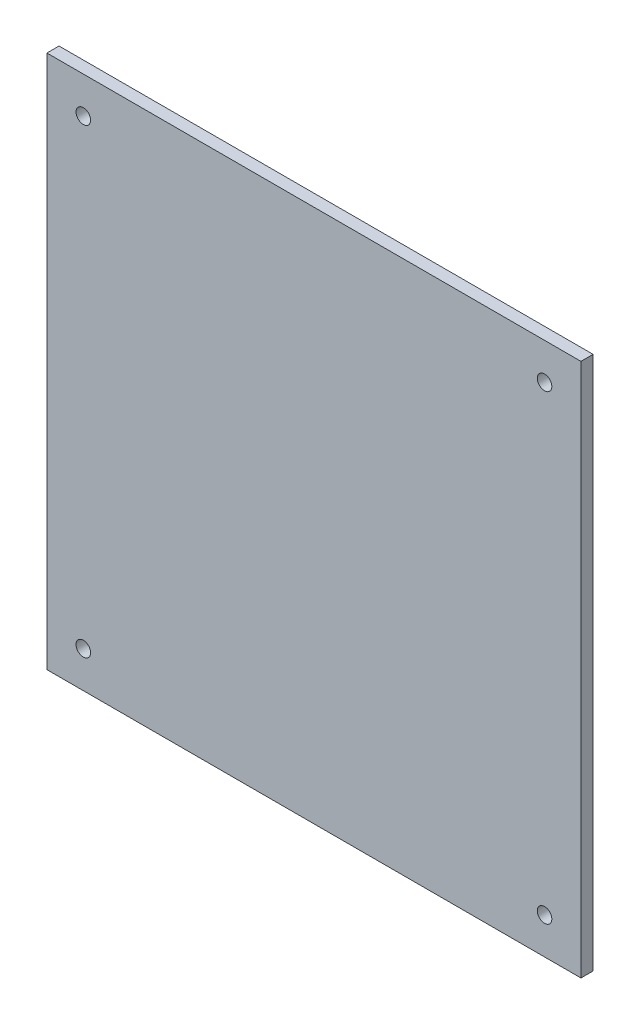
ISO-10303-21;
HEADER;
FILE_DESCRIPTION(('STEP AP214'),'2;1');
FILE_NAME('part.step','',(''),(''),'','','');
FILE_SCHEMA(('AUTOMOTIVE_DESIGN { 1 0 10303 214 1 1 1 1 }'));
ENDSEC;
DATA;
#1=APPLICATION_CONTEXT('core data for automotive mechanical design processes');
#2=APPLICATION_PROTOCOL_DEFINITION('international standard','automotive_design',2000,#1);
#3=PRODUCT_CONTEXT('',#1,'mechanical');
#4=PRODUCT('Part','Part','',(#3));
#5=PRODUCT_RELATED_PRODUCT_CATEGORY('part','',(#4));
#6=PRODUCT_DEFINITION_FORMATION('','',#4);
#7=PRODUCT_DEFINITION_CONTEXT('part definition',#1,'design');
#8=PRODUCT_DEFINITION('design','',#6,#7);
#9=PRODUCT_DEFINITION_SHAPE('','',#8);
#10=(LENGTH_UNIT() NAMED_UNIT(*) SI_UNIT(.MILLI.,.METRE.));
#11=(NAMED_UNIT(*) PLANE_ANGLE_UNIT() SI_UNIT($,.RADIAN.));
#12=(NAMED_UNIT(*) SI_UNIT($,.STERADIAN.) SOLID_ANGLE_UNIT());
#13=UNCERTAINTY_MEASURE_WITH_UNIT(LENGTH_MEASURE(1.E-05),#10,'distance_accuracy_value','');
#14=(GEOMETRIC_REPRESENTATION_CONTEXT(3) GLOBAL_UNCERTAINTY_ASSIGNED_CONTEXT((#13)) GLOBAL_UNIT_ASSIGNED_CONTEXT((#10,
#11,#12)) REPRESENTATION_CONTEXT('',''));
#15=CARTESIAN_POINT('',(0.,0.,0.));
#16=DIRECTION('',(0.,0.,1.));
#17=DIRECTION('',(1.,0.,0.));
#18=AXIS2_PLACEMENT_3D('',#15,#16,#17);
#19=CARTESIAN_POINT('',(0.,0.,10.));
#20=DIRECTION('',(0.,0.,-1.));
#21=DIRECTION('',(-1.,0.,0.));
#22=AXIS2_PLACEMENT_3D('',#19,#20,#21);
#23=PLANE('',#22);
#24=DIRECTION('',(0.,1.,0.));
#25=VECTOR('',#24,1.);
#26=CARTESIAN_POINT('',(162.708333333333,214.097222222222,10.));
#27=LINE('',#26,#25);
#28=CARTESIAN_POINT('',(162.708333333333,-225.902777777778,10.));
#29=VERTEX_POINT('',#28);
#30=CARTESIAN_POINT('',(162.708333333333,214.097222222222,10.));
#31=VERTEX_POINT('',#30);
#32=EDGE_CURVE('E88',#29,#31,#27,.T.);
#33=ORIENTED_EDGE('',*,*,#32,.T.);
#34=DIRECTION('',(-1.,0.,0.));
#35=VECTOR('',#34,1.);
#36=CARTESIAN_POINT('',(162.708333333333,214.097222222222,10.));
#37=LINE('',#36,#35);
#38=CARTESIAN_POINT('',(-277.291666666667,214.097222222222,10.));
#39=VERTEX_POINT('',#38);
#40=EDGE_CURVE('E83',#31,#39,#37,.T.);
#41=ORIENTED_EDGE('',*,*,#40,.T.);
#42=DIRECTION('',(0.,-1.,0.));
#43=VECTOR('',#42,1.);
#44=CARTESIAN_POINT('',(-277.291666666667,214.097222222222,10.));
#45=LINE('',#44,#43);
#46=CARTESIAN_POINT('',(-277.291666666667,-225.902777777778,10.));
#47=VERTEX_POINT('',#46);
#48=EDGE_CURVE('E86',#39,#47,#45,.T.);
#49=ORIENTED_EDGE('',*,*,#48,.T.);
#50=DIRECTION('',(1.,0.,0.));
#51=VECTOR('',#50,1.);
#52=CARTESIAN_POINT('',(162.708333333333,-225.902777777778,10.));
#53=LINE('',#52,#51);
#54=EDGE_CURVE('E53',#47,#29,#53,.T.);
#55=ORIENTED_EDGE('',*,*,#54,.T.);
#56=EDGE_LOOP('',(#33,#41,#49,#55));
#57=FACE_BOUND('',#56,.T.);
#58=CARTESIAN_POINT('',(132.708333333333,184.097222222222,10.));
#59=DIRECTION('',(0.,0.,1.));
#60=DIRECTION('',(1.,0.,0.));
#61=AXIS2_PLACEMENT_3D('',#58,#59,#60);
#62=CIRCLE('',#61,6.00000000000002);
#63=CARTESIAN_POINT('',(138.708333333333,184.097222222222,10.));
#64=VERTEX_POINT('',#63);
#65=EDGE_CURVE('E103',#64,#64,#62,.T.);
#66=ORIENTED_EDGE('',*,*,#65,.F.);
#67=EDGE_LOOP('',(#66));
#68=FACE_BOUND('',#67,.T.);
#69=CARTESIAN_POINT('',(-247.291666666667,184.097222222222,10.));
#70=DIRECTION('',(0.,0.,1.));
#71=DIRECTION('',(1.,0.,0.));
#72=AXIS2_PLACEMENT_3D('',#69,#70,#71);
#73=CIRCLE('',#72,6.00000000000002);
#74=CARTESIAN_POINT('',(-241.291666666667,184.097222222222,10.));
#75=VERTEX_POINT('',#74);
#76=EDGE_CURVE('E118',#75,#75,#73,.T.);
#77=ORIENTED_EDGE('',*,*,#76,.F.);
#78=EDGE_LOOP('',(#77));
#79=FACE_BOUND('',#78,.T.);
#80=CARTESIAN_POINT('',(-247.291666666667,-195.902777777778,10.));
#81=DIRECTION('',(0.,0.,1.));
#82=DIRECTION('',(1.,0.,0.));
#83=AXIS2_PLACEMENT_3D('',#80,#81,#82);
#84=CIRCLE('',#83,6.00000000000002);
#85=CARTESIAN_POINT('',(-241.291666666667,-195.902777777778,10.));
#86=VERTEX_POINT('',#85);
#87=EDGE_CURVE('E124',#86,#86,#84,.T.);
#88=ORIENTED_EDGE('',*,*,#87,.F.);
#89=EDGE_LOOP('',(#88));
#90=FACE_BOUND('',#89,.T.);
#91=CARTESIAN_POINT('',(132.708333333333,-195.902777777778,10.));
#92=DIRECTION('',(0.,0.,1.));
#93=DIRECTION('',(1.,0.,0.));
#94=AXIS2_PLACEMENT_3D('',#91,#92,#93);
#95=CIRCLE('',#94,6.00000000000002);
#96=CARTESIAN_POINT('',(138.708333333333,-195.902777777778,10.));
#97=VERTEX_POINT('',#96);
#98=EDGE_CURVE('E130',#97,#97,#95,.T.);
#99=ORIENTED_EDGE('',*,*,#98,.F.);
#100=EDGE_LOOP('',(#99));
#101=FACE_BOUND('',#100,.T.);
#102=ADVANCED_FACE('F36',(#57,#68,#79,#90,#101),#23,.F.);
#103=CARTESIAN_POINT('',(0.,0.,0.));
#104=DIRECTION('',(0.,0.,-1.));
#105=DIRECTION('',(-1.,0.,0.));
#106=AXIS2_PLACEMENT_3D('',#103,#104,#105);
#107=PLANE('',#106);
#108=CARTESIAN_POINT('',(-247.291666666667,-195.902777777778,0.));
#109=DIRECTION('',(0.,0.,1.));
#110=DIRECTION('',(1.,0.,0.));
#111=AXIS2_PLACEMENT_3D('',#108,#109,#110);
#112=CIRCLE('',#111,6.00000000000002);
#113=CARTESIAN_POINT('',(-241.291666666667,-195.902777777778,0.));
#114=VERTEX_POINT('',#113);
#115=EDGE_CURVE('E127',#114,#114,#112,.T.);
#116=ORIENTED_EDGE('',*,*,#115,.T.);
#117=EDGE_LOOP('',(#116));
#118=FACE_BOUND('',#117,.T.);
#119=CARTESIAN_POINT('',(132.708333333333,184.097222222222,0.));
#120=DIRECTION('',(0.,0.,1.));
#121=DIRECTION('',(1.,0.,0.));
#122=AXIS2_PLACEMENT_3D('',#119,#120,#121);
#123=CIRCLE('',#122,6.00000000000002);
#124=CARTESIAN_POINT('',(138.708333333333,184.097222222222,0.));
#125=VERTEX_POINT('',#124);
#126=EDGE_CURVE('E115',#125,#125,#123,.T.);
#127=ORIENTED_EDGE('',*,*,#126,.T.);
#128=EDGE_LOOP('',(#127));
#129=FACE_BOUND('',#128,.T.);
#130=DIRECTION('',(0.,1.,0.));
#131=VECTOR('',#130,1.);
#132=CARTESIAN_POINT('',(162.708333333333,214.097222222222,0.));
#133=LINE('',#132,#131);
#134=CARTESIAN_POINT('',(162.708333333333,-225.902777777778,0.));
#135=VERTEX_POINT('',#134);
#136=CARTESIAN_POINT('',(162.708333333333,214.097222222222,0.));
#137=VERTEX_POINT('',#136);
#138=EDGE_CURVE('E100',#135,#137,#133,.T.);
#139=ORIENTED_EDGE('',*,*,#138,.F.);
#140=DIRECTION('',(1.,0.,0.));
#141=VECTOR('',#140,1.);
#142=CARTESIAN_POINT('',(162.708333333333,-225.902777777778,0.));
#143=LINE('',#142,#141);
#144=CARTESIAN_POINT('',(-277.291666666667,-225.902777777778,0.));
#145=VERTEX_POINT('',#144);
#146=EDGE_CURVE('E76',#145,#135,#143,.T.);
#147=ORIENTED_EDGE('',*,*,#146,.F.);
#148=DIRECTION('',(0.,-1.,0.));
#149=VECTOR('',#148,1.);
#150=CARTESIAN_POINT('',(-277.291666666667,214.097222222222,0.));
#151=LINE('',#150,#149);
#152=CARTESIAN_POINT('',(-277.291666666667,214.097222222222,0.));
#153=VERTEX_POINT('',#152);
#154=EDGE_CURVE('E70',#153,#145,#151,.T.);
#155=ORIENTED_EDGE('',*,*,#154,.F.);
#156=DIRECTION('',(-1.,0.,0.));
#157=VECTOR('',#156,1.);
#158=CARTESIAN_POINT('',(162.708333333333,214.097222222222,0.));
#159=LINE('',#158,#157);
#160=EDGE_CURVE('E92',#137,#153,#159,.T.);
#161=ORIENTED_EDGE('',*,*,#160,.F.);
#162=EDGE_LOOP('',(#139,#147,#155,#161));
#163=FACE_BOUND('',#162,.T.);
#164=CARTESIAN_POINT('',(-247.291666666667,184.097222222222,0.));
#165=DIRECTION('',(0.,0.,1.));
#166=DIRECTION('',(1.,0.,0.));
#167=AXIS2_PLACEMENT_3D('',#164,#165,#166);
#168=CIRCLE('',#167,6.00000000000002);
#169=CARTESIAN_POINT('',(-241.291666666667,184.097222222222,0.));
#170=VERTEX_POINT('',#169);
#171=EDGE_CURVE('E121',#170,#170,#168,.T.);
#172=ORIENTED_EDGE('',*,*,#171,.T.);
#173=EDGE_LOOP('',(#172));
#174=FACE_BOUND('',#173,.T.);
#175=CARTESIAN_POINT('',(132.708333333333,-195.902777777778,0.));
#176=DIRECTION('',(0.,0.,1.));
#177=DIRECTION('',(1.,0.,0.));
#178=AXIS2_PLACEMENT_3D('',#175,#176,#177);
#179=CIRCLE('',#178,6.00000000000002);
#180=CARTESIAN_POINT('',(138.708333333333,-195.902777777778,0.));
#181=VERTEX_POINT('',#180);
#182=EDGE_CURVE('E133',#181,#181,#179,.T.);
#183=ORIENTED_EDGE('',*,*,#182,.T.);
#184=EDGE_LOOP('',(#183));
#185=FACE_BOUND('',#184,.T.);
#186=ADVANCED_FACE('F111',(#118,#129,#163,#174,#185),#107,.T.);
#187=CARTESIAN_POINT('',(162.708333333333,214.097222222222,10.));
#188=DIRECTION('',(-1.,0.,0.));
#189=DIRECTION('',(0.,-1.,0.));
#190=AXIS2_PLACEMENT_3D('',#187,#188,#189);
#191=PLANE('',#190);
#192=ORIENTED_EDGE('',*,*,#138,.T.);
#193=DIRECTION('',(0.,0.,-1.));
#194=VECTOR('',#193,1.);
#195=CARTESIAN_POINT('',(162.708333333333,214.097222222222,10.));
#196=LINE('',#195,#194);
#197=EDGE_CURVE('E11',#31,#137,#196,.T.);
#198=ORIENTED_EDGE('',*,*,#197,.F.);
#199=ORIENTED_EDGE('',*,*,#32,.F.);
#200=DIRECTION('',(0.,0.,-1.));
#201=VECTOR('',#200,1.);
#202=CARTESIAN_POINT('',(162.708333333333,-225.902777777778,10.));
#203=LINE('',#202,#201);
#204=EDGE_CURVE('E96',#29,#135,#203,.T.);
#205=ORIENTED_EDGE('',*,*,#204,.T.);
#206=EDGE_LOOP('',(#192,#198,#199,#205));
#207=FACE_BOUND('',#206,.T.);
#208=ADVANCED_FACE('F38',(#207),#191,.F.);
#209=CARTESIAN_POINT('',(162.708333333333,214.097222222222,10.));
#210=DIRECTION('',(0.,-1.,0.));
#211=DIRECTION('',(1.,0.,0.));
#212=AXIS2_PLACEMENT_3D('',#209,#210,#211);
#213=PLANE('',#212);
#214=ORIENTED_EDGE('',*,*,#160,.T.);
#215=DIRECTION('',(0.,0.,-1.));
#216=VECTOR('',#215,1.);
#217=CARTESIAN_POINT('',(-277.291666666667,214.097222222222,10.));
#218=LINE('',#217,#216);
#219=EDGE_CURVE('E45',#39,#153,#218,.T.);
#220=ORIENTED_EDGE('',*,*,#219,.F.);
#221=ORIENTED_EDGE('',*,*,#40,.F.);
#222=ORIENTED_EDGE('',*,*,#197,.T.);
#223=EDGE_LOOP('',(#214,#220,#221,#222));
#224=FACE_BOUND('',#223,.T.);
#225=ADVANCED_FACE('F91',(#224),#213,.F.);
#226=CARTESIAN_POINT('',(-277.291666666667,214.097222222222,10.));
#227=DIRECTION('',(1.,0.,0.));
#228=DIRECTION('',(0.,1.,0.));
#229=AXIS2_PLACEMENT_3D('',#226,#227,#228);
#230=PLANE('',#229);
#231=ORIENTED_EDGE('',*,*,#154,.T.);
#232=DIRECTION('',(0.,0.,-1.));
#233=VECTOR('',#232,1.);
#234=CARTESIAN_POINT('',(-277.291666666667,-225.902777777778,10.));
#235=LINE('',#234,#233);
#236=EDGE_CURVE('E93',#47,#145,#235,.T.);
#237=ORIENTED_EDGE('',*,*,#236,.F.);
#238=ORIENTED_EDGE('',*,*,#48,.F.);
#239=ORIENTED_EDGE('',*,*,#219,.T.);
#240=EDGE_LOOP('',(#231,#237,#238,#239));
#241=FACE_BOUND('',#240,.T.);
#242=ADVANCED_FACE('F94',(#241),#230,.F.);
#243=CARTESIAN_POINT('',(162.708333333333,-225.902777777778,10.));
#244=DIRECTION('',(0.,1.,0.));
#245=DIRECTION('',(-1.,0.,0.));
#246=AXIS2_PLACEMENT_3D('',#243,#244,#245);
#247=PLANE('',#246);
#248=ORIENTED_EDGE('',*,*,#146,.T.);
#249=ORIENTED_EDGE('',*,*,#204,.F.);
#250=ORIENTED_EDGE('',*,*,#54,.F.);
#251=ORIENTED_EDGE('',*,*,#236,.T.);
#252=EDGE_LOOP('',(#248,#249,#250,#251));
#253=FACE_BOUND('',#252,.T.);
#254=ADVANCED_FACE('F108',(#253),#247,.F.);
#255=CARTESIAN_POINT('',(132.708333333333,184.097222222222,10.));
#256=DIRECTION('',(0.,0.,-1.));
#257=DIRECTION('',(-1.,0.,0.));
#258=AXIS2_PLACEMENT_3D('',#255,#256,#257);
#259=CYLINDRICAL_SURFACE('',#258,6.00000000000002);
#260=ORIENTED_EDGE('',*,*,#65,.T.);
#261=EDGE_LOOP('',(#260));
#262=FACE_BOUND('',#261,.T.);
#263=ORIENTED_EDGE('',*,*,#126,.F.);
#264=EDGE_LOOP('',(#263));
#265=FACE_BOUND('',#264,.T.);
#266=ADVANCED_FACE('F150',(#262,#265),#259,.F.);
#267=CARTESIAN_POINT('',(-247.291666666667,184.097222222222,10.));
#268=DIRECTION('',(0.,0.,-1.));
#269=DIRECTION('',(-1.,0.,0.));
#270=AXIS2_PLACEMENT_3D('',#267,#268,#269);
#271=CYLINDRICAL_SURFACE('',#270,6.00000000000002);
#272=ORIENTED_EDGE('',*,*,#76,.T.);
#273=EDGE_LOOP('',(#272));
#274=FACE_BOUND('',#273,.T.);
#275=ORIENTED_EDGE('',*,*,#171,.F.);
#276=EDGE_LOOP('',(#275));
#277=FACE_BOUND('',#276,.T.);
#278=ADVANCED_FACE('F196',(#274,#277),#271,.F.);
#279=CARTESIAN_POINT('',(-247.291666666667,-195.902777777778,10.));
#280=DIRECTION('',(0.,0.,-1.));
#281=DIRECTION('',(-1.,0.,0.));
#282=AXIS2_PLACEMENT_3D('',#279,#280,#281);
#283=CYLINDRICAL_SURFACE('',#282,6.00000000000002);
#284=ORIENTED_EDGE('',*,*,#87,.T.);
#285=EDGE_LOOP('',(#284));
#286=FACE_BOUND('',#285,.T.);
#287=ORIENTED_EDGE('',*,*,#115,.F.);
#288=EDGE_LOOP('',(#287));
#289=FACE_BOUND('',#288,.T.);
#290=ADVANCED_FACE('F204',(#286,#289),#283,.F.);
#291=CARTESIAN_POINT('',(132.708333333333,-195.902777777778,10.));
#292=DIRECTION('',(0.,0.,-1.));
#293=DIRECTION('',(-1.,0.,0.));
#294=AXIS2_PLACEMENT_3D('',#291,#292,#293);
#295=CYLINDRICAL_SURFACE('',#294,6.00000000000002);
#296=ORIENTED_EDGE('',*,*,#98,.T.);
#297=EDGE_LOOP('',(#296));
#298=FACE_BOUND('',#297,.T.);
#299=ORIENTED_EDGE('',*,*,#182,.F.);
#300=EDGE_LOOP('',(#299));
#301=FACE_BOUND('',#300,.T.);
#302=ADVANCED_FACE('F139',(#298,#301),#295,.F.);
#303=CLOSED_SHELL('',(#102,#186,#208,#225,#242,#254,#266,#278,#290,#302));
#304=MANIFOLD_SOLID_BREP('B2',#303);
#305=ADVANCED_BREP_SHAPE_REPRESENTATION('',(#18,#304),#14);
#306=SHAPE_DEFINITION_REPRESENTATION(#9,#305);
ENDSEC;
END-ISO-10303-21;
